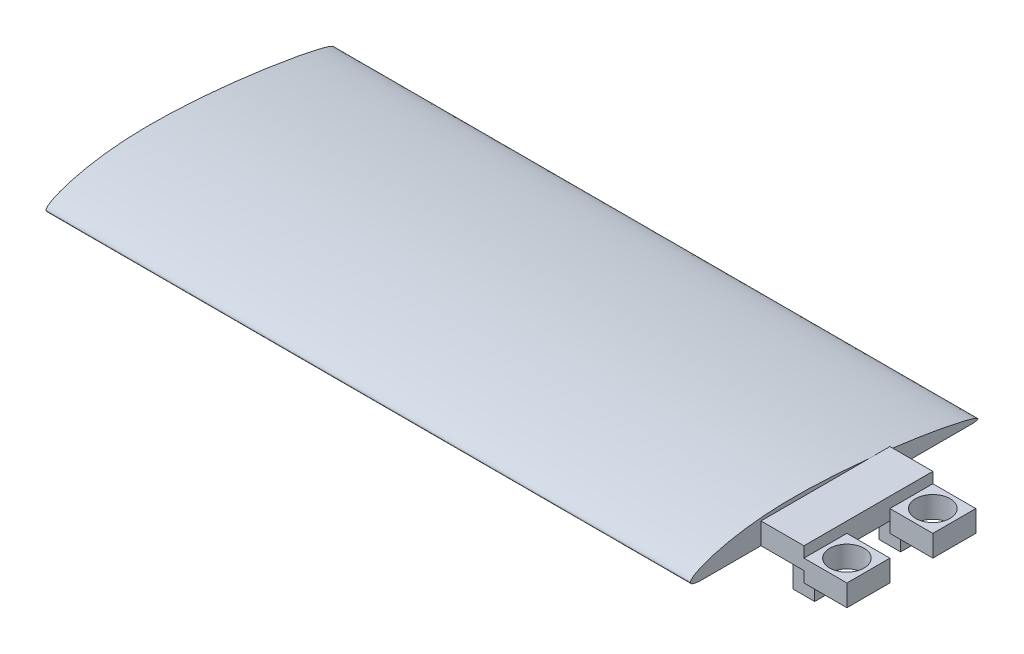
ISO-10303-21;
HEADER;
FILE_DESCRIPTION(('STEP AP214'),'2;1');
FILE_NAME('part.step','',(''),(''),'','','');
FILE_SCHEMA(('AUTOMOTIVE_DESIGN { 1 0 10303 214 1 1 1 1 }'));
ENDSEC;
DATA;
#1=APPLICATION_CONTEXT('core data for automotive mechanical design processes');
#2=APPLICATION_PROTOCOL_DEFINITION('international standard','automotive_design',2000,#1);
#3=PRODUCT_CONTEXT('',#1,'mechanical');
#4=PRODUCT('Part','Part','',(#3));
#5=PRODUCT_RELATED_PRODUCT_CATEGORY('part','',(#4));
#6=PRODUCT_DEFINITION_FORMATION('','',#4);
#7=PRODUCT_DEFINITION_CONTEXT('part definition',#1,'design');
#8=PRODUCT_DEFINITION('design','',#6,#7);
#9=PRODUCT_DEFINITION_SHAPE('','',#8);
#10=(LENGTH_UNIT() NAMED_UNIT(*) SI_UNIT(.MILLI.,.METRE.));
#11=(NAMED_UNIT(*) PLANE_ANGLE_UNIT() SI_UNIT($,.RADIAN.));
#12=(NAMED_UNIT(*) SI_UNIT($,.STERADIAN.) SOLID_ANGLE_UNIT());
#13=UNCERTAINTY_MEASURE_WITH_UNIT(LENGTH_MEASURE(1.E-05),#10,'distance_accuracy_value','');
#14=(GEOMETRIC_REPRESENTATION_CONTEXT(3) GLOBAL_UNCERTAINTY_ASSIGNED_CONTEXT((#13)) GLOBAL_UNIT_ASSIGNED_CONTEXT((#10,
#11,#12)) REPRESENTATION_CONTEXT('',''));
#15=CARTESIAN_POINT('',(0.,0.,0.));
#16=DIRECTION('',(0.,0.,1.));
#17=DIRECTION('',(1.,0.,0.));
#18=AXIS2_PLACEMENT_3D('',#15,#16,#17);
#19=CARTESIAN_POINT('',(-20.,7.5,-25.));
#20=DIRECTION('',(1.,0.,0.));
#21=DIRECTION('',(0.,0.,1.));
#22=AXIS2_PLACEMENT_3D('',#19,#20,#21);
#23=PLANE('',#22);
#24=CARTESIAN_POINT('',(-20.,2.5,-43.5818633417016));
#25=CARTESIAN_POINT('',(-20.,2.5,-54.109415672038));
#26=CARTESIAN_POINT('',(-20.,14.5377672604346,5.82154619961291));
#27=CARTESIAN_POINT('',(-20.,2.5,26.2287373231827));
#28=CARTESIAN_POINT('',(-20.,2.5,18.5389838197817));
#29=B_SPLINE_CURVE_WITH_KNOTS('',3,(#24,#25,#26,#27,#28),.UNSPECIFIED.,.F.,.F.,(4,1,4),(0.,
0.583473653659747,1.),.UNSPECIFIED.);
#30=CARTESIAN_POINT('',(-20.,6.94114038584259,-25.));
#31=VERTEX_POINT('',#30);
#32=CARTESIAN_POINT('',(-20.,7.50000001951237,-20.0732175677515));
#33=VERTEX_POINT('',#32);
#34=EDGE_CURVE('E12',#31,#33,#29,.T.);
#35=ORIENTED_EDGE('',*,*,#34,.T.);
#36=DIRECTION('',(0.,0.,-1.));
#37=VECTOR('',#36,1.);
#38=CARTESIAN_POINT('',(-20.,7.5,-25.));
#39=LINE('',#38,#37);
#40=CARTESIAN_POINT('',(-20.,7.5,-25.));
#41=VERTEX_POINT('',#40);
#42=EDGE_CURVE('E198',#33,#41,#39,.T.);
#43=ORIENTED_EDGE('',*,*,#42,.T.);
#44=DIRECTION('',(0.,-1.,0.));
#45=VECTOR('',#44,1.);
#46=CARTESIAN_POINT('',(-20.,7.5,-25.));
#47=LINE('',#46,#45);
#48=EDGE_CURVE('E211',#41,#31,#47,.T.);
#49=ORIENTED_EDGE('',*,*,#48,.T.);
#50=EDGE_LOOP('',(#35,#43,#49));
#51=FACE_BOUND('',#50,.T.);
#52=ADVANCED_FACE('F48',(#51),#23,.F.);
#53=CARTESIAN_POINT('',(-10.,5.,-5.));
#54=DIRECTION('',(1.,0.,0.));
#55=DIRECTION('',(0.,0.,1.));
#56=AXIS2_PLACEMENT_3D('',#53,#54,#55);
#57=PLANE('',#56);
#58=DIRECTION('',(0.,0.,1.));
#59=VECTOR('',#58,1.);
#60=CARTESIAN_POINT('',(-10.,2.5,-25.));
#61=LINE('',#60,#59);
#62=CARTESIAN_POINT('',(-10.,2.5,-5.));
#63=VERTEX_POINT('',#62);
#64=CARTESIAN_POINT('',(-10.,2.5,-2.5));
#65=VERTEX_POINT('',#64);
#66=EDGE_CURVE('E187',#63,#65,#61,.T.);
#67=ORIENTED_EDGE('',*,*,#66,.F.);
#68=DIRECTION('',(0.,-1.,0.));
#69=VECTOR('',#68,1.);
#70=CARTESIAN_POINT('',(-10.,5.,-5.));
#71=LINE('',#70,#69);
#72=CARTESIAN_POINT('',(-10.,0.,-5.));
#73=VERTEX_POINT('',#72);
#74=EDGE_CURVE('E285',#63,#73,#71,.T.);
#75=ORIENTED_EDGE('',*,*,#74,.T.);
#76=DIRECTION('',(0.,0.,-1.));
#77=VECTOR('',#76,1.);
#78=CARTESIAN_POINT('',(-10.,0.,-5.));
#79=LINE('',#78,#77);
#80=CARTESIAN_POINT('',(-10.,0.,-2.5));
#81=VERTEX_POINT('',#80);
#82=EDGE_CURVE('E252',#81,#73,#79,.T.);
#83=ORIENTED_EDGE('',*,*,#82,.F.);
#84=DIRECTION('',(0.,1.,0.));
#85=VECTOR('',#84,1.);
#86=CARTESIAN_POINT('',(-10.,-5.,-2.5));
#87=LINE('',#86,#85);
#88=EDGE_CURVE('E238',#81,#65,#87,.T.);
#89=ORIENTED_EDGE('',*,*,#88,.T.);
#90=EDGE_LOOP('',(#67,#75,#83,#89));
#91=FACE_BOUND('',#90,.T.);
#92=ADVANCED_FACE('F50',(#91),#57,.F.);
#93=CARTESIAN_POINT('',(-10.,2.5,2.5));
#94=VERTEX_POINT('',#93);
#95=CARTESIAN_POINT('',(-10.,2.5,5.));
#96=VERTEX_POINT('',#95);
#97=EDGE_CURVE('E184',#94,#96,#61,.T.);
#98=ORIENTED_EDGE('',*,*,#97,.F.);
#99=DIRECTION('',(0.,-1.,0.));
#100=VECTOR('',#99,1.);
#101=CARTESIAN_POINT('',(-10.,-5.,2.5));
#102=LINE('',#101,#100);
#103=CARTESIAN_POINT('',(-10.,0.,2.5));
#104=VERTEX_POINT('',#103);
#105=EDGE_CURVE('E239',#94,#104,#102,.T.);
#106=ORIENTED_EDGE('',*,*,#105,.T.);
#107=CARTESIAN_POINT('',(-10.,0.,5.));
#108=VERTEX_POINT('',#107);
#109=EDGE_CURVE('E269',#108,#104,#79,.T.);
#110=ORIENTED_EDGE('',*,*,#109,.F.);
#111=DIRECTION('',(0.,-1.,0.));
#112=VECTOR('',#111,1.);
#113=CARTESIAN_POINT('',(-10.,5.,5.));
#114=LINE('',#113,#112);
#115=EDGE_CURVE('E268',#96,#108,#114,.T.);
#116=ORIENTED_EDGE('',*,*,#115,.F.);
#117=EDGE_LOOP('',(#98,#106,#110,#116));
#118=FACE_BOUND('',#117,.T.);
#119=ADVANCED_FACE('F324',(#118),#57,.F.);
#120=CARTESIAN_POINT('',(0.,5.,0.));
#121=DIRECTION('',(0.,1.,0.));
#122=DIRECTION('',(0.,0.,1.));
#123=AXIS2_PLACEMENT_3D('',#120,#121,#122);
#124=PLANE('',#123);
#125=CARTESIAN_POINT('',(-5.,5.,0.));
#126=DIRECTION('',(0.,-1.,0.));
#127=DIRECTION('',(0.,0.,1.));
#128=AXIS2_PLACEMENT_3D('',#125,#126,#127);
#129=CIRCLE('',#128,4.);
#130=CARTESIAN_POINT('',(-5.,5.,4.));
#131=VERTEX_POINT('',#130);
#132=EDGE_CURVE('E249',#131,#131,#129,.T.);
#133=ORIENTED_EDGE('',*,*,#132,.T.);
#134=EDGE_LOOP('',(#133));
#135=FACE_BOUND('',#134,.T.);
#136=DIRECTION('',(0.,0.,-1.));
#137=VECTOR('',#136,1.);
#138=CARTESIAN_POINT('',(-10.,5.,-5.));
#139=LINE('',#138,#137);
#140=CARTESIAN_POINT('',(-10.,5.,5.));
#141=VERTEX_POINT('',#140);
#142=CARTESIAN_POINT('',(-10.,5.,-5.));
#143=VERTEX_POINT('',#142);
#144=EDGE_CURVE('E255',#141,#143,#139,.T.);
#145=ORIENTED_EDGE('',*,*,#144,.F.);
#146=DIRECTION('',(-1.,0.,0.));
#147=VECTOR('',#146,1.);
#148=CARTESIAN_POINT('',(0.,5.,5.));
#149=LINE('',#148,#147);
#150=CARTESIAN_POINT('',(0.,5.,5.));
#151=VERTEX_POINT('',#150);
#152=EDGE_CURVE('E265',#151,#141,#149,.T.);
#153=ORIENTED_EDGE('',*,*,#152,.F.);
#154=DIRECTION('',(0.,0.,1.));
#155=VECTOR('',#154,1.);
#156=CARTESIAN_POINT('',(0.,5.,-5.));
#157=LINE('',#156,#155);
#158=CARTESIAN_POINT('',(0.,5.,-5.));
#159=VERTEX_POINT('',#158);
#160=EDGE_CURVE('E262',#159,#151,#157,.T.);
#161=ORIENTED_EDGE('',*,*,#160,.F.);
#162=DIRECTION('',(1.,0.,0.));
#163=VECTOR('',#162,1.);
#164=CARTESIAN_POINT('',(0.,5.,-5.));
#165=LINE('',#164,#163);
#166=EDGE_CURVE('E258',#143,#159,#165,.T.);
#167=ORIENTED_EDGE('',*,*,#166,.F.);
#168=EDGE_LOOP('',(#145,#153,#161,#167));
#169=FACE_BOUND('',#168,.T.);
#170=ADVANCED_FACE('F381',(#135,#169),#124,.T.);
#171=CARTESIAN_POINT('',(-15.,-5.,-2.5));
#172=DIRECTION('',(0.,0.,1.));
#173=DIRECTION('',(-1.,0.,0.));
#174=AXIS2_PLACEMENT_3D('',#171,#172,#173);
#175=PLANE('',#174);
#176=DIRECTION('',(1.,0.,0.));
#177=VECTOR('',#176,1.);
#178=CARTESIAN_POINT('',(-15.,2.5,-2.5));
#179=LINE('',#178,#177);
#180=CARTESIAN_POINT('',(-15.,2.5,-2.5));
#181=VERTEX_POINT('',#180);
#182=EDGE_CURVE('E222',#181,#65,#179,.T.);
#183=ORIENTED_EDGE('',*,*,#182,.T.);
#184=ORIENTED_EDGE('',*,*,#88,.F.);
#185=CARTESIAN_POINT('',(-10.,-5.,-2.5));
#186=VERTEX_POINT('',#185);
#187=EDGE_CURVE('E224',#186,#81,#87,.T.);
#188=ORIENTED_EDGE('',*,*,#187,.F.);
#189=DIRECTION('',(1.,0.,0.));
#190=VECTOR('',#189,1.);
#191=CARTESIAN_POINT('',(-15.,-5.,-2.5));
#192=LINE('',#191,#190);
#193=CARTESIAN_POINT('',(-15.,-5.,-2.5));
#194=VERTEX_POINT('',#193);
#195=EDGE_CURVE('E234',#194,#186,#192,.T.);
#196=ORIENTED_EDGE('',*,*,#195,.F.);
#197=DIRECTION('',(0.,1.,0.));
#198=VECTOR('',#197,1.);
#199=CARTESIAN_POINT('',(-15.,-5.,-2.5));
#200=LINE('',#199,#198);
#201=EDGE_CURVE('E225',#194,#181,#200,.T.);
#202=ORIENTED_EDGE('',*,*,#201,.T.);
#203=EDGE_LOOP('',(#183,#184,#188,#196,#202));
#204=FACE_BOUND('',#203,.T.);
#205=ADVANCED_FACE('F311',(#204),#175,.F.);
#206=CARTESIAN_POINT('',(-15.,-5.,2.49999999999999));
#207=DIRECTION('',(0.,0.,-1.));
#208=DIRECTION('',(1.,0.,0.));
#209=AXIS2_PLACEMENT_3D('',#206,#207,#208);
#210=PLANE('',#209);
#211=DIRECTION('',(-1.,0.,0.));
#212=VECTOR('',#211,1.);
#213=CARTESIAN_POINT('',(-15.,2.5,2.49999999999999));
#214=LINE('',#213,#212);
#215=CARTESIAN_POINT('',(-15.,2.5,2.49999999999999));
#216=VERTEX_POINT('',#215);
#217=EDGE_CURVE('E219',#94,#216,#214,.T.);
#218=ORIENTED_EDGE('',*,*,#217,.T.);
#219=DIRECTION('',(0.,-1.,0.));
#220=VECTOR('',#219,1.);
#221=CARTESIAN_POINT('',(-15.,-5.,2.49999999999999));
#222=LINE('',#221,#220);
#223=CARTESIAN_POINT('',(-15.,-5.,2.49999999999999));
#224=VERTEX_POINT('',#223);
#225=EDGE_CURVE('E228',#216,#224,#222,.T.);
#226=ORIENTED_EDGE('',*,*,#225,.T.);
#227=DIRECTION('',(1.,0.,0.));
#228=VECTOR('',#227,1.);
#229=CARTESIAN_POINT('',(-15.,-5.,2.49999999999999));
#230=LINE('',#229,#228);
#231=CARTESIAN_POINT('',(-10.,-5.,2.5));
#232=VERTEX_POINT('',#231);
#233=EDGE_CURVE('E245',#224,#232,#230,.T.);
#234=ORIENTED_EDGE('',*,*,#233,.T.);
#235=EDGE_CURVE('E237',#104,#232,#102,.T.);
#236=ORIENTED_EDGE('',*,*,#235,.F.);
#237=ORIENTED_EDGE('',*,*,#105,.F.);
#238=EDGE_LOOP('',(#218,#226,#234,#236,#237));
#239=FACE_BOUND('',#238,.T.);
#240=ADVANCED_FACE('F320',(#239),#210,.F.);
#241=CARTESIAN_POINT('',(-15.,0.,0.));
#242=DIRECTION('',(1.,0.,0.));
#243=DIRECTION('',(0.,0.,1.));
#244=AXIS2_PLACEMENT_3D('',#241,#242,#243);
#245=PLANE('',#244);
#246=DIRECTION('',(0.,0.,-1.));
#247=VECTOR('',#246,1.);
#248=CARTESIAN_POINT('',(-15.,2.5,0.));
#249=LINE('',#248,#247);
#250=EDGE_CURVE('E52',#216,#181,#249,.T.);
#251=ORIENTED_EDGE('',*,*,#250,.T.);
#252=ORIENTED_EDGE('',*,*,#201,.F.);
#253=DIRECTION('',(0.,0.,-1.));
#254=VECTOR('',#253,1.);
#255=CARTESIAN_POINT('',(-15.,-5.,2.49999999999999));
#256=LINE('',#255,#254);
#257=EDGE_CURVE('E232',#224,#194,#256,.T.);
#258=ORIENTED_EDGE('',*,*,#257,.F.);
#259=ORIENTED_EDGE('',*,*,#225,.F.);
#260=EDGE_LOOP('',(#251,#252,#258,#259));
#261=FACE_BOUND('',#260,.T.);
#262=ADVANCED_FACE('F317',(#261),#245,.F.);
#263=CARTESIAN_POINT('',(0.,0.,0.));
#264=DIRECTION('',(0.,1.,0.));
#265=DIRECTION('',(0.,0.,1.));
#266=AXIS2_PLACEMENT_3D('',#263,#264,#265);
#267=PLANE('',#266);
#268=ORIENTED_EDGE('',*,*,#109,.T.);
#269=EDGE_CURVE('E273',#104,#81,#79,.T.);
#270=ORIENTED_EDGE('',*,*,#269,.T.);
#271=ORIENTED_EDGE('',*,*,#82,.T.);
#272=DIRECTION('',(1.,0.,0.));
#273=VECTOR('',#272,1.);
#274=CARTESIAN_POINT('',(0.,0.,-5.));
#275=LINE('',#274,#273);
#276=CARTESIAN_POINT('',(0.,0.,-5.));
#277=VERTEX_POINT('',#276);
#278=EDGE_CURVE('E272',#73,#277,#275,.T.);
#279=ORIENTED_EDGE('',*,*,#278,.T.);
#280=DIRECTION('',(0.,0.,1.));
#281=VECTOR('',#280,1.);
#282=CARTESIAN_POINT('',(0.,0.,-5.));
#283=LINE('',#282,#281);
#284=CARTESIAN_POINT('',(0.,0.,5.));
#285=VERTEX_POINT('',#284);
#286=EDGE_CURVE('E276',#277,#285,#283,.T.);
#287=ORIENTED_EDGE('',*,*,#286,.T.);
#288=DIRECTION('',(-1.,0.,0.));
#289=VECTOR('',#288,1.);
#290=CARTESIAN_POINT('',(0.,0.,5.));
#291=LINE('',#290,#289);
#292=EDGE_CURVE('E259',#285,#108,#291,.T.);
#293=ORIENTED_EDGE('',*,*,#292,.T.);
#294=EDGE_LOOP('',(#268,#270,#271,#279,#287,#293));
#295=FACE_BOUND('',#294,.T.);
#296=CARTESIAN_POINT('',(-5.,0.,0.));
#297=DIRECTION('',(0.,-1.,0.));
#298=DIRECTION('',(0.,0.,1.));
#299=AXIS2_PLACEMENT_3D('',#296,#297,#298);
#300=CIRCLE('',#299,4.);
#301=CARTESIAN_POINT('',(-5.,0.,4.));
#302=VERTEX_POINT('',#301);
#303=EDGE_CURVE('E248',#302,#302,#300,.T.);
#304=ORIENTED_EDGE('',*,*,#303,.F.);
#305=EDGE_LOOP('',(#304));
#306=FACE_BOUND('',#305,.T.);
#307=ADVANCED_FACE('F300',(#295,#306),#267,.F.);
#308=CARTESIAN_POINT('',(0.,5.,-5.));
#309=DIRECTION('',(0.,0.,1.));
#310=DIRECTION('',(-1.,0.,0.));
#311=AXIS2_PLACEMENT_3D('',#308,#309,#310);
#312=PLANE('',#311);
#313=ORIENTED_EDGE('',*,*,#278,.F.);
#314=ORIENTED_EDGE('',*,*,#74,.F.);
#315=EDGE_CURVE('E286',#143,#63,#71,.T.);
#316=ORIENTED_EDGE('',*,*,#315,.F.);
#317=ORIENTED_EDGE('',*,*,#166,.T.);
#318=DIRECTION('',(0.,-1.,0.));
#319=VECTOR('',#318,1.);
#320=CARTESIAN_POINT('',(0.,5.,-5.));
#321=LINE('',#320,#319);
#322=EDGE_CURVE('E284',#159,#277,#321,.T.);
#323=ORIENTED_EDGE('',*,*,#322,.T.);
#324=EDGE_LOOP('',(#313,#314,#316,#317,#323));
#325=FACE_BOUND('',#324,.T.);
#326=ADVANCED_FACE('F296',(#325),#312,.F.);
#327=CARTESIAN_POINT('',(0.,5.,-5.));
#328=DIRECTION('',(-1.,0.,0.));
#329=DIRECTION('',(0.,0.,-1.));
#330=AXIS2_PLACEMENT_3D('',#327,#328,#329);
#331=PLANE('',#330);
#332=ORIENTED_EDGE('',*,*,#286,.F.);
#333=ORIENTED_EDGE('',*,*,#322,.F.);
#334=ORIENTED_EDGE('',*,*,#160,.T.);
#335=DIRECTION('',(0.,-1.,0.));
#336=VECTOR('',#335,1.);
#337=CARTESIAN_POINT('',(0.,5.,5.));
#338=LINE('',#337,#336);
#339=EDGE_CURVE('E282',#151,#285,#338,.T.);
#340=ORIENTED_EDGE('',*,*,#339,.T.);
#341=EDGE_LOOP('',(#332,#333,#334,#340));
#342=FACE_BOUND('',#341,.T.);
#343=ADVANCED_FACE('F392',(#342),#331,.F.);
#344=CARTESIAN_POINT('',(0.,5.,5.));
#345=DIRECTION('',(0.,0.,-1.));
#346=DIRECTION('',(1.,0.,0.));
#347=AXIS2_PLACEMENT_3D('',#344,#345,#346);
#348=PLANE('',#347);
#349=ORIENTED_EDGE('',*,*,#292,.F.);
#350=ORIENTED_EDGE('',*,*,#339,.F.);
#351=ORIENTED_EDGE('',*,*,#152,.T.);
#352=DIRECTION('',(0.,-1.,0.));
#353=VECTOR('',#352,1.);
#354=CARTESIAN_POINT('',(-10.,7.5,5.));
#355=LINE('',#354,#353);
#356=CARTESIAN_POINT('',(-10.,7.5,5.));
#357=VERTEX_POINT('',#356);
#358=EDGE_CURVE('E217',#357,#141,#355,.T.);
#359=ORIENTED_EDGE('',*,*,#358,.F.);
#360=DIRECTION('',(-1.,0.,0.));
#361=VECTOR('',#360,1.);
#362=CARTESIAN_POINT('',(-10.,7.5,5.));
#363=LINE('',#362,#361);
#364=CARTESIAN_POINT('',(-20.,7.5,5.));
#365=VERTEX_POINT('',#364);
#366=EDGE_CURVE('E194',#357,#365,#363,.T.);
#367=ORIENTED_EDGE('',*,*,#366,.T.);
#368=DIRECTION('',(0.,-1.,0.));
#369=VECTOR('',#368,1.);
#370=CARTESIAN_POINT('',(-20.,7.5,5.));
#371=LINE('',#370,#369);
#372=CARTESIAN_POINT('',(-20.,2.5,5.));
#373=VERTEX_POINT('',#372);
#374=EDGE_CURVE('E214',#365,#373,#371,.T.);
#375=ORIENTED_EDGE('',*,*,#374,.T.);
#376=DIRECTION('',(-1.,0.,0.));
#377=VECTOR('',#376,1.);
#378=CARTESIAN_POINT('',(-10.,2.5,5.));
#379=LINE('',#378,#377);
#380=EDGE_CURVE('E205',#96,#373,#379,.T.);
#381=ORIENTED_EDGE('',*,*,#380,.F.);
#382=ORIENTED_EDGE('',*,*,#115,.T.);
#383=EDGE_LOOP('',(#349,#350,#351,#359,#367,#375,#381,#382));
#384=FACE_BOUND('',#383,.T.);
#385=ADVANCED_FACE('F328',(#384),#348,.F.);
#386=CARTESIAN_POINT('',(-5.,5.,0.));
#387=DIRECTION('',(0.,-1.,0.));
#388=DIRECTION('',(0.,0.,-1.));
#389=AXIS2_PLACEMENT_3D('',#386,#387,#388);
#390=CYLINDRICAL_SURFACE('',#389,4.);
#391=ORIENTED_EDGE('',*,*,#132,.F.);
#392=EDGE_LOOP('',(#391));
#393=FACE_BOUND('',#392,.T.);
#394=ORIENTED_EDGE('',*,*,#303,.T.);
#395=EDGE_LOOP('',(#394));
#396=FACE_BOUND('',#395,.T.);
#397=ADVANCED_FACE('F375',(#393,#396),#390,.F.);
#398=CARTESIAN_POINT('',(-15.,-5.,2.49999999999999));
#399=DIRECTION('',(0.,1.,0.));
#400=DIRECTION('',(0.,0.,1.));
#401=AXIS2_PLACEMENT_3D('',#398,#399,#400);
#402=PLANE('',#401);
#403=DIRECTION('',(0.,0.,-1.));
#404=VECTOR('',#403,1.);
#405=CARTESIAN_POINT('',(-10.,-5.,2.5));
#406=LINE('',#405,#404);
#407=EDGE_CURVE('E229',#232,#186,#406,.T.);
#408=ORIENTED_EDGE('',*,*,#407,.F.);
#409=ORIENTED_EDGE('',*,*,#233,.F.);
#410=ORIENTED_EDGE('',*,*,#257,.T.);
#411=ORIENTED_EDGE('',*,*,#195,.T.);
#412=EDGE_LOOP('',(#408,#409,#410,#411));
#413=FACE_BOUND('',#412,.T.);
#414=ADVANCED_FACE('F372',(#413),#402,.F.);
#415=CARTESIAN_POINT('',(-10.,0.,0.));
#416=DIRECTION('',(1.,0.,0.));
#417=DIRECTION('',(0.,0.,1.));
#418=AXIS2_PLACEMENT_3D('',#415,#416,#417);
#419=PLANE('',#418);
#420=ORIENTED_EDGE('',*,*,#235,.T.);
#421=ORIENTED_EDGE('',*,*,#407,.T.);
#422=ORIENTED_EDGE('',*,*,#187,.T.);
#423=ORIENTED_EDGE('',*,*,#269,.F.);
#424=EDGE_LOOP('',(#420,#421,#422,#423));
#425=FACE_BOUND('',#424,.T.);
#426=ADVANCED_FACE('F308',(#425),#419,.T.);
#427=CARTESIAN_POINT('',(-10.,7.5,-25.));
#428=DIRECTION('',(-1.,0.,0.));
#429=DIRECTION('',(0.,0.,-1.));
#430=AXIS2_PLACEMENT_3D('',#427,#428,#429);
#431=PLANE('',#430);
#432=ORIENTED_EDGE('',*,*,#144,.T.);
#433=ORIENTED_EDGE('',*,*,#315,.T.);
#434=CARTESIAN_POINT('',(-10.,2.5,-25.));
#435=VERTEX_POINT('',#434);
#436=EDGE_CURVE('E73',#435,#63,#61,.T.);
#437=ORIENTED_EDGE('',*,*,#436,.F.);
#438=DIRECTION('',(0.,-1.,0.));
#439=VECTOR('',#438,1.);
#440=CARTESIAN_POINT('',(-10.,7.5,-25.));
#441=LINE('',#440,#439);
#442=CARTESIAN_POINT('',(-10.,7.5,-25.));
#443=VERTEX_POINT('',#442);
#444=EDGE_CURVE('E203',#443,#435,#441,.T.);
#445=ORIENTED_EDGE('',*,*,#444,.F.);
#446=DIRECTION('',(0.,0.,1.));
#447=VECTOR('',#446,1.);
#448=CARTESIAN_POINT('',(-10.,7.5,-25.));
#449=LINE('',#448,#447);
#450=EDGE_CURVE('E192',#443,#357,#449,.T.);
#451=ORIENTED_EDGE('',*,*,#450,.T.);
#452=ORIENTED_EDGE('',*,*,#358,.T.);
#453=EDGE_LOOP('',(#432,#433,#437,#445,#451,#452));
#454=FACE_BOUND('',#453,.T.);
#455=ADVANCED_FACE('F359',(#454),#431,.F.);
#456=CARTESIAN_POINT('',(0.,2.5,0.));
#457=DIRECTION('',(0.,1.,0.));
#458=DIRECTION('',(0.,0.,1.));
#459=AXIS2_PLACEMENT_3D('',#456,#457,#458);
#460=PLANE('',#459);
#461=ORIENTED_EDGE('',*,*,#250,.F.);
#462=ORIENTED_EDGE('',*,*,#217,.F.);
#463=ORIENTED_EDGE('',*,*,#97,.T.);
#464=ORIENTED_EDGE('',*,*,#380,.T.);
#465=DIRECTION('',(0.,0.,-1.));
#466=VECTOR('',#465,1.);
#467=CARTESIAN_POINT('',(-20.,2.5,18.5389838197817));
#468=LINE('',#467,#466);
#469=CARTESIAN_POINT('',(-20.,2.5,18.5389838197817));
#470=VERTEX_POINT('',#469);
#471=EDGE_CURVE('E178',#470,#373,#468,.T.);
#472=ORIENTED_EDGE('',*,*,#471,.F.);
#473=DIRECTION('',(1.,0.,0.));
#474=VECTOR('',#473,1.);
#475=CARTESIAN_POINT('',(-170.,2.5,18.5389838197817));
#476=LINE('',#475,#474);
#477=CARTESIAN_POINT('',(-170.,2.5,18.5389838197817));
#478=VERTEX_POINT('',#477);
#479=EDGE_CURVE('E171',#478,#470,#476,.T.);
#480=ORIENTED_EDGE('',*,*,#479,.F.);
#481=DIRECTION('',(0.,0.,-1.));
#482=VECTOR('',#481,1.);
#483=CARTESIAN_POINT('',(-170.,2.5,18.5389838197817));
#484=LINE('',#483,#482);
#485=CARTESIAN_POINT('',(-170.,2.5,-43.5818633417016));
#486=VERTEX_POINT('',#485);
#487=EDGE_CURVE('E177',#478,#486,#484,.T.);
#488=ORIENTED_EDGE('',*,*,#487,.T.);
#489=DIRECTION('',(1.,0.,0.));
#490=VECTOR('',#489,1.);
#491=CARTESIAN_POINT('',(-170.,2.5,-43.5818633417016));
#492=LINE('',#491,#490);
#493=CARTESIAN_POINT('',(-20.,2.5,-43.5818633417016));
#494=VERTEX_POINT('',#493);
#495=EDGE_CURVE('E174',#486,#494,#492,.T.);
#496=ORIENTED_EDGE('',*,*,#495,.T.);
#497=CARTESIAN_POINT('',(-20.,2.5,-25.));
#498=VERTEX_POINT('',#497);
#499=EDGE_CURVE('E334',#498,#494,#468,.T.);
#500=ORIENTED_EDGE('',*,*,#499,.F.);
#501=DIRECTION('',(1.,0.,0.));
#502=VECTOR('',#501,1.);
#503=CARTESIAN_POINT('',(-10.,2.5,-25.));
#504=LINE('',#503,#502);
#505=EDGE_CURVE('E195',#498,#435,#504,.T.);
#506=ORIENTED_EDGE('',*,*,#505,.T.);
#507=ORIENTED_EDGE('',*,*,#436,.T.);
#508=ORIENTED_EDGE('',*,*,#66,.T.);
#509=ORIENTED_EDGE('',*,*,#182,.F.);
#510=EDGE_LOOP('',(#461,#462,#463,#464,#472,#480,#488,#496,#500,#506,#507,#508,#509));
#511=FACE_BOUND('',#510,.T.);
#512=ADVANCED_FACE('F182',(#511),#460,.F.);
#513=CARTESIAN_POINT('',(-10.,7.5,-25.));
#514=DIRECTION('',(0.,0.,1.));
#515=DIRECTION('',(-1.,0.,0.));
#516=AXIS2_PLACEMENT_3D('',#513,#514,#515);
#517=PLANE('',#516);
#518=ORIENTED_EDGE('',*,*,#505,.F.);
#519=EDGE_CURVE('E210',#31,#498,#47,.T.);
#520=ORIENTED_EDGE('',*,*,#519,.F.);
#521=ORIENTED_EDGE('',*,*,#48,.F.);
#522=DIRECTION('',(1.,0.,0.));
#523=VECTOR('',#522,1.);
#524=CARTESIAN_POINT('',(-10.,7.5,-25.));
#525=LINE('',#524,#523);
#526=EDGE_CURVE('E202',#41,#443,#525,.T.);
#527=ORIENTED_EDGE('',*,*,#526,.T.);
#528=ORIENTED_EDGE('',*,*,#444,.T.);
#529=EDGE_LOOP('',(#518,#520,#521,#527,#528));
#530=FACE_BOUND('',#529,.T.);
#531=ADVANCED_FACE('F355',(#530),#517,.F.);
#532=CARTESIAN_POINT('',(0.,7.5,0.));
#533=DIRECTION('',(0.,1.,0.));
#534=DIRECTION('',(0.,0.,1.));
#535=AXIS2_PLACEMENT_3D('',#532,#533,#534);
#536=PLANE('',#535);
#537=ORIENTED_EDGE('',*,*,#450,.F.);
#538=ORIENTED_EDGE('',*,*,#526,.F.);
#539=ORIENTED_EDGE('',*,*,#42,.F.);
#540=EDGE_CURVE('E199',#365,#33,#39,.T.);
#541=ORIENTED_EDGE('',*,*,#540,.F.);
#542=ORIENTED_EDGE('',*,*,#366,.F.);
#543=EDGE_LOOP('',(#537,#538,#539,#541,#542));
#544=FACE_BOUND('',#543,.T.);
#545=ADVANCED_FACE('F352',(#544),#536,.T.);
#546=CARTESIAN_POINT('',(-20.,8.39569452755327,-7.51523728594603));
#547=DIRECTION('',(-1.,0.,0.));
#548=DIRECTION('',(0.,1.,0.));
#549=AXIS2_PLACEMENT_3D('',#546,#547,#548);
#550=PLANE('',#549);
#551=ORIENTED_EDGE('',*,*,#519,.T.);
#552=ORIENTED_EDGE('',*,*,#499,.T.);
#553=EDGE_CURVE('E58',#494,#31,#29,.T.);
#554=ORIENTED_EDGE('',*,*,#553,.T.);
#555=EDGE_LOOP('',(#551,#552,#554));
#556=FACE_BOUND('',#555,.T.);
#557=ADVANCED_FACE('F350',(#556),#550,.F.);
#558=CARTESIAN_POINT('',(-170.,2.5,-43.5818633417016));
#559=CARTESIAN_POINT('',(-170.,2.5,-54.109415672038));
#560=CARTESIAN_POINT('',(-170.,14.5377672604346,5.8215461996129));
#561=CARTESIAN_POINT('',(-170.,2.5,26.2287373231827));
#562=CARTESIAN_POINT('',(-170.,2.5,18.5389838197817));
#563=B_SPLINE_CURVE_WITH_KNOTS('',3,(#558,#559,#560,#561,#562),.UNSPECIFIED.,.F.,.F.,(4,1,4),
(0.,0.583473653659747,1.),.UNSPECIFIED.);
#564=DIRECTION('',(1.,0.,0.));
#565=VECTOR('',#564,1.);
#566=SURFACE_OF_LINEAR_EXTRUSION('',#563,#565);
#567=ORIENTED_EDGE('',*,*,#553,.F.);
#568=ORIENTED_EDGE('',*,*,#495,.F.);
#569=EDGE_CURVE('E167',#486,#478,#563,.T.);
#570=ORIENTED_EDGE('',*,*,#569,.T.);
#571=ORIENTED_EDGE('',*,*,#479,.T.);
#572=EDGE_CURVE('E59',#33,#470,#29,.T.);
#573=ORIENTED_EDGE('',*,*,#572,.F.);
#574=ORIENTED_EDGE('',*,*,#34,.F.);
#575=EDGE_LOOP('',(#567,#568,#570,#571,#573,#574));
#576=FACE_BOUND('',#575,.T.);
#577=ADVANCED_FACE('F169',(#576),#566,.T.);
#578=CARTESIAN_POINT('',(-170.,8.39569452755327,-7.51523728594604));
#579=DIRECTION('',(-1.,0.,0.));
#580=DIRECTION('',(0.,1.,0.));
#581=AXIS2_PLACEMENT_3D('',#578,#579,#580);
#582=PLANE('',#581);
#583=ORIENTED_EDGE('',*,*,#569,.F.);
#584=ORIENTED_EDGE('',*,*,#487,.F.);
#585=EDGE_LOOP('',(#583,#584));
#586=FACE_BOUND('',#585,.T.);
#587=ADVANCED_FACE('F180',(#586),#582,.T.);
#588=ORIENTED_EDGE('',*,*,#540,.T.);
#589=ORIENTED_EDGE('',*,*,#572,.T.);
#590=ORIENTED_EDGE('',*,*,#471,.T.);
#591=ORIENTED_EDGE('',*,*,#374,.F.);
#592=EDGE_LOOP('',(#588,#589,#590,#591));
#593=FACE_BOUND('',#592,.T.);
#594=ADVANCED_FACE('F332',(#593),#550,.F.);
#595=CLOSED_SHELL('',(#52,#92,#119,#170,#205,#240,#262,#307,#326,#343,#385,#397,#414,#426,#455,
#512,#531,#545,#557,#577,#587,#594));
#596=MANIFOLD_SOLID_BREP('B2',#595);
#597=CARTESIAN_POINT('',(-15.,-5.,-22.5));
#598=DIRECTION('',(0.,0.,1.));
#599=DIRECTION('',(-1.,0.,0.));
#600=AXIS2_PLACEMENT_3D('',#597,#598,#599);
#601=PLANE('',#600);
#602=DIRECTION('',(0.,1.,0.));
#603=VECTOR('',#602,1.);
#604=CARTESIAN_POINT('',(-9.99999999999999,-5.,-22.5));
#605=LINE('',#604,#603);
#606=CARTESIAN_POINT('',(-9.99999999999999,-5.,-22.5));
#607=VERTEX_POINT('',#606);
#608=CARTESIAN_POINT('',(-9.99999999999999,5.,-22.5));
#609=VERTEX_POINT('',#608);
#610=EDGE_CURVE('E631',#607,#609,#605,.T.);
#611=ORIENTED_EDGE('',*,*,#610,.F.);
#612=DIRECTION('',(1.,0.,0.));
#613=VECTOR('',#612,1.);
#614=CARTESIAN_POINT('',(-15.,-5.,-22.5));
#615=LINE('',#614,#613);
#616=CARTESIAN_POINT('',(-15.,-5.,-22.5));
#617=VERTEX_POINT('',#616);
#618=EDGE_CURVE('E630',#617,#607,#615,.T.);
#619=ORIENTED_EDGE('',*,*,#618,.F.);
#620=DIRECTION('',(0.,1.,0.));
#621=VECTOR('',#620,1.);
#622=CARTESIAN_POINT('',(-15.,-5.,-22.5));
#623=LINE('',#622,#621);
#624=CARTESIAN_POINT('',(-15.,5.,-22.5));
#625=VERTEX_POINT('',#624);
#626=EDGE_CURVE('E625',#617,#625,#623,.T.);
#627=ORIENTED_EDGE('',*,*,#626,.T.);
#628=DIRECTION('',(1.,0.,0.));
#629=VECTOR('',#628,1.);
#630=CARTESIAN_POINT('',(-15.,5.,-22.5));
#631=LINE('',#630,#629);
#632=EDGE_CURVE('E46',#625,#609,#631,.T.);
#633=ORIENTED_EDGE('',*,*,#632,.T.);
#634=EDGE_LOOP('',(#611,#619,#627,#633));
#635=FACE_BOUND('',#634,.T.);
#636=ADVANCED_FACE('F568',(#635),#601,.F.);
#637=CARTESIAN_POINT('',(-15.,5.,-17.5));
#638=DIRECTION('',(0.,-1.,0.));
#639=DIRECTION('',(0.,0.,-1.));
#640=AXIS2_PLACEMENT_3D('',#637,#638,#639);
#641=PLANE('',#640);
#642=DIRECTION('',(0.,0.,1.));
#643=VECTOR('',#642,1.);
#644=CARTESIAN_POINT('',(-9.99999999999999,5.,-17.5));
#645=LINE('',#644,#643);
#646=CARTESIAN_POINT('',(-9.99999999999999,5.,-17.5));
#647=VERTEX_POINT('',#646);
#648=EDGE_CURVE('E633',#609,#647,#645,.T.);
#649=ORIENTED_EDGE('',*,*,#648,.F.);
#650=ORIENTED_EDGE('',*,*,#632,.F.);
#651=DIRECTION('',(0.,0.,1.));
#652=VECTOR('',#651,1.);
#653=CARTESIAN_POINT('',(-15.,5.,-17.5));
#654=LINE('',#653,#652);
#655=CARTESIAN_POINT('',(-15.,5.,-17.5));
#656=VERTEX_POINT('',#655);
#657=EDGE_CURVE('E609',#625,#656,#654,.T.);
#658=ORIENTED_EDGE('',*,*,#657,.T.);
#659=DIRECTION('',(1.,0.,0.));
#660=VECTOR('',#659,1.);
#661=CARTESIAN_POINT('',(-15.,5.,-17.5));
#662=LINE('',#661,#660);
#663=EDGE_CURVE('E576',#656,#647,#662,.T.);
#664=ORIENTED_EDGE('',*,*,#663,.T.);
#665=EDGE_LOOP('',(#649,#650,#658,#664));
#666=FACE_BOUND('',#665,.T.);
#667=ADVANCED_FACE('F623',(#666),#641,.F.);
#668=CARTESIAN_POINT('',(-15.,-5.,-17.5));
#669=DIRECTION('',(0.,0.,-1.));
#670=DIRECTION('',(1.,0.,0.));
#671=AXIS2_PLACEMENT_3D('',#668,#669,#670);
#672=PLANE('',#671);
#673=DIRECTION('',(0.,-1.,0.));
#674=VECTOR('',#673,1.);
#675=CARTESIAN_POINT('',(-9.99999999999999,-5.,-17.5));
#676=LINE('',#675,#674);
#677=CARTESIAN_POINT('',(-9.99999999999999,-5.,-17.5));
#678=VERTEX_POINT('',#677);
#679=EDGE_CURVE('E619',#647,#678,#676,.T.);
#680=ORIENTED_EDGE('',*,*,#679,.F.);
#681=ORIENTED_EDGE('',*,*,#663,.F.);
#682=DIRECTION('',(0.,-1.,0.));
#683=VECTOR('',#682,1.);
#684=CARTESIAN_POINT('',(-15.,-5.,-17.5));
#685=LINE('',#684,#683);
#686=CARTESIAN_POINT('',(-15.,-5.,-17.5));
#687=VERTEX_POINT('',#686);
#688=EDGE_CURVE('E612',#656,#687,#685,.T.);
#689=ORIENTED_EDGE('',*,*,#688,.T.);
#690=DIRECTION('',(1.,0.,0.));
#691=VECTOR('',#690,1.);
#692=CARTESIAN_POINT('',(-15.,-5.,-17.5));
#693=LINE('',#692,#691);
#694=EDGE_CURVE('E622',#687,#678,#693,.T.);
#695=ORIENTED_EDGE('',*,*,#694,.T.);
#696=EDGE_LOOP('',(#680,#681,#689,#695));
#697=FACE_BOUND('',#696,.T.);
#698=ADVANCED_FACE('F618',(#697),#672,.F.);
#699=CARTESIAN_POINT('',(-15.,-5.,-17.5));
#700=DIRECTION('',(0.,1.,0.));
#701=DIRECTION('',(0.,0.,1.));
#702=AXIS2_PLACEMENT_3D('',#699,#700,#701);
#703=PLANE('',#702);
#704=DIRECTION('',(0.,0.,-1.));
#705=VECTOR('',#704,1.);
#706=CARTESIAN_POINT('',(-9.99999999999999,-5.,-17.5));
#707=LINE('',#706,#705);
#708=EDGE_CURVE('E598',#678,#607,#707,.T.);
#709=ORIENTED_EDGE('',*,*,#708,.F.);
#710=ORIENTED_EDGE('',*,*,#694,.F.);
#711=DIRECTION('',(0.,0.,-1.));
#712=VECTOR('',#711,1.);
#713=CARTESIAN_POINT('',(-15.,-5.,-17.5));
#714=LINE('',#713,#712);
#715=EDGE_CURVE('E584',#687,#617,#714,.T.);
#716=ORIENTED_EDGE('',*,*,#715,.T.);
#717=ORIENTED_EDGE('',*,*,#618,.T.);
#718=EDGE_LOOP('',(#709,#710,#716,#717));
#719=FACE_BOUND('',#718,.T.);
#720=ADVANCED_FACE('F642',(#719),#703,.F.);
#721=CARTESIAN_POINT('',(-15.,0.,0.));
#722=DIRECTION('',(1.,0.,0.));
#723=DIRECTION('',(0.,0.,1.));
#724=AXIS2_PLACEMENT_3D('',#721,#722,#723);
#725=PLANE('',#724);
#726=ORIENTED_EDGE('',*,*,#626,.F.);
#727=ORIENTED_EDGE('',*,*,#715,.F.);
#728=ORIENTED_EDGE('',*,*,#688,.F.);
#729=ORIENTED_EDGE('',*,*,#657,.F.);
#730=EDGE_LOOP('',(#726,#727,#728,#729));
#731=FACE_BOUND('',#730,.T.);
#732=ADVANCED_FACE('F614',(#731),#725,.F.);
#733=CARTESIAN_POINT('',(-10.,0.,0.));
#734=DIRECTION('',(1.,0.,0.));
#735=DIRECTION('',(0.,0.,1.));
#736=AXIS2_PLACEMENT_3D('',#733,#734,#735);
#737=PLANE('',#736);
#738=ORIENTED_EDGE('',*,*,#610,.T.);
#739=ORIENTED_EDGE('',*,*,#648,.T.);
#740=ORIENTED_EDGE('',*,*,#679,.T.);
#741=ORIENTED_EDGE('',*,*,#708,.T.);
#742=EDGE_LOOP('',(#738,#739,#740,#741));
#743=FACE_BOUND('',#742,.T.);
#744=ADVANCED_FACE('F638',(#743),#737,.T.);
#745=CLOSED_SHELL('',(#636,#667,#698,#720,#732,#744));
#746=MANIFOLD_SOLID_BREP('B6',#745);
#747=CARTESIAN_POINT('',(0.,5.,0.));
#748=DIRECTION('',(0.,-1.,0.));
#749=DIRECTION('',(0.,0.,-1.));
#750=AXIS2_PLACEMENT_3D('',#747,#748,#749);
#751=PLANE('',#750);
#752=DIRECTION('',(0.,0.,1.));
#753=VECTOR('',#752,1.);
#754=CARTESIAN_POINT('',(0.,5.,-15.));
#755=LINE('',#754,#753);
#756=CARTESIAN_POINT('',(0.,5.,-25.));
#757=VERTEX_POINT('',#756);
#758=CARTESIAN_POINT('',(0.,5.,-15.));
#759=VERTEX_POINT('',#758);
#760=EDGE_CURVE('E748',#757,#759,#755,.T.);
#761=ORIENTED_EDGE('',*,*,#760,.F.);
#762=DIRECTION('',(1.,0.,0.));
#763=VECTOR('',#762,1.);
#764=CARTESIAN_POINT('',(0.,5.,-25.));
#765=LINE('',#764,#763);
#766=CARTESIAN_POINT('',(-10.,5.,-25.));
#767=VERTEX_POINT('',#766);
#768=EDGE_CURVE('E751',#767,#757,#765,.T.);
#769=ORIENTED_EDGE('',*,*,#768,.F.);
#770=DIRECTION('',(0.,0.,-1.));
#771=VECTOR('',#770,1.);
#772=CARTESIAN_POINT('',(-9.99999999999999,5.,-15.));
#773=LINE('',#772,#771);
#774=CARTESIAN_POINT('',(-9.99999999999999,5.,-15.));
#775=VERTEX_POINT('',#774);
#776=EDGE_CURVE('E739',#775,#767,#773,.T.);
#777=ORIENTED_EDGE('',*,*,#776,.F.);
#778=DIRECTION('',(-1.,0.,0.));
#779=VECTOR('',#778,1.);
#780=CARTESIAN_POINT('',(0.,5.,-15.));
#781=LINE('',#780,#779);
#782=EDGE_CURVE('E744',#759,#775,#781,.T.);
#783=ORIENTED_EDGE('',*,*,#782,.F.);
#784=EDGE_LOOP('',(#761,#769,#777,#783));
#785=FACE_BOUND('',#784,.T.);
#786=CARTESIAN_POINT('',(-5.,5.,-20.));
#787=DIRECTION('',(0.,-1.,0.));
#788=DIRECTION('',(0.,0.,-1.));
#789=AXIS2_PLACEMENT_3D('',#786,#787,#788);
#790=CIRCLE('',#789,4.);
#791=CARTESIAN_POINT('',(-5.,5.,-24.));
#792=VERTEX_POINT('',#791);
#793=EDGE_CURVE('E760',#792,#792,#790,.T.);
#794=ORIENTED_EDGE('',*,*,#793,.T.);
#795=EDGE_LOOP('',(#794));
#796=FACE_BOUND('',#795,.T.);
#797=ADVANCED_FACE('F692',(#785,#796),#751,.F.);
#798=CARTESIAN_POINT('',(0.,0.,0.));
#799=DIRECTION('',(0.,-1.,0.));
#800=DIRECTION('',(0.,0.,-1.));
#801=AXIS2_PLACEMENT_3D('',#798,#799,#800);
#802=PLANE('',#801);
#803=DIRECTION('',(0.,0.,1.));
#804=VECTOR('',#803,1.);
#805=CARTESIAN_POINT('',(0.,0.,-15.));
#806=LINE('',#805,#804);
#807=CARTESIAN_POINT('',(0.,0.,-25.));
#808=VERTEX_POINT('',#807);
#809=CARTESIAN_POINT('',(0.,0.,-15.));
#810=VERTEX_POINT('',#809);
#811=EDGE_CURVE('E756',#808,#810,#806,.T.);
#812=ORIENTED_EDGE('',*,*,#811,.T.);
#813=DIRECTION('',(-1.,0.,0.));
#814=VECTOR('',#813,1.);
#815=CARTESIAN_POINT('',(0.,0.,-15.));
#816=LINE('',#815,#814);
#817=CARTESIAN_POINT('',(-9.99999999999999,0.,-15.));
#818=VERTEX_POINT('',#817);
#819=EDGE_CURVE('E759',#810,#818,#816,.T.);
#820=ORIENTED_EDGE('',*,*,#819,.T.);
#821=DIRECTION('',(0.,0.,-1.));
#822=VECTOR('',#821,1.);
#823=CARTESIAN_POINT('',(-9.99999999999999,0.,-15.));
#824=LINE('',#823,#822);
#825=CARTESIAN_POINT('',(-10.,0.,-25.));
#826=VERTEX_POINT('',#825);
#827=EDGE_CURVE('E742',#818,#826,#824,.T.);
#828=ORIENTED_EDGE('',*,*,#827,.T.);
#829=DIRECTION('',(1.,0.,0.));
#830=VECTOR('',#829,1.);
#831=CARTESIAN_POINT('',(0.,0.,-25.));
#832=LINE('',#831,#830);
#833=EDGE_CURVE('E763',#826,#808,#832,.T.);
#834=ORIENTED_EDGE('',*,*,#833,.T.);
#835=EDGE_LOOP('',(#812,#820,#828,#834));
#836=FACE_BOUND('',#835,.T.);
#837=CARTESIAN_POINT('',(-5.,0.,-20.));
#838=DIRECTION('',(0.,-1.,0.));
#839=DIRECTION('',(0.,0.,-1.));
#840=AXIS2_PLACEMENT_3D('',#837,#838,#839);
#841=CIRCLE('',#840,4.);
#842=CARTESIAN_POINT('',(-5.,0.,-24.));
#843=VERTEX_POINT('',#842);
#844=EDGE_CURVE('E768',#843,#843,#841,.T.);
#845=ORIENTED_EDGE('',*,*,#844,.F.);
#846=EDGE_LOOP('',(#845));
#847=FACE_BOUND('',#846,.T.);
#848=ADVANCED_FACE('F781',(#836,#847),#802,.T.);
#849=CARTESIAN_POINT('',(0.,5.,-15.));
#850=DIRECTION('',(-1.,0.,0.));
#851=DIRECTION('',(0.,0.,-1.));
#852=AXIS2_PLACEMENT_3D('',#849,#850,#851);
#853=PLANE('',#852);
#854=ORIENTED_EDGE('',*,*,#811,.F.);
#855=DIRECTION('',(0.,-1.,0.));
#856=VECTOR('',#855,1.);
#857=CARTESIAN_POINT('',(0.,5.,-25.));
#858=LINE('',#857,#856);
#859=EDGE_CURVE('E709',#757,#808,#858,.T.);
#860=ORIENTED_EDGE('',*,*,#859,.F.);
#861=ORIENTED_EDGE('',*,*,#760,.T.);
#862=DIRECTION('',(0.,-1.,0.));
#863=VECTOR('',#862,1.);
#864=CARTESIAN_POINT('',(0.,5.,-15.));
#865=LINE('',#864,#863);
#866=EDGE_CURVE('E566',#759,#810,#865,.T.);
#867=ORIENTED_EDGE('',*,*,#866,.T.);
#868=EDGE_LOOP('',(#854,#860,#861,#867));
#869=FACE_BOUND('',#868,.T.);
#870=ADVANCED_FACE('F694',(#869),#853,.F.);
#871=CARTESIAN_POINT('',(0.,5.,-15.));
#872=DIRECTION('',(0.,0.,-1.));
#873=DIRECTION('',(1.,0.,0.));
#874=AXIS2_PLACEMENT_3D('',#871,#872,#873);
#875=PLANE('',#874);
#876=ORIENTED_EDGE('',*,*,#819,.F.);
#877=ORIENTED_EDGE('',*,*,#866,.F.);
#878=ORIENTED_EDGE('',*,*,#782,.T.);
#879=DIRECTION('',(0.,-1.,0.));
#880=VECTOR('',#879,1.);
#881=CARTESIAN_POINT('',(-9.99999999999999,5.,-15.));
#882=LINE('',#881,#880);
#883=EDGE_CURVE('E701',#775,#818,#882,.T.);
#884=ORIENTED_EDGE('',*,*,#883,.T.);
#885=EDGE_LOOP('',(#876,#877,#878,#884));
#886=FACE_BOUND('',#885,.T.);
#887=ADVANCED_FACE('F745',(#886),#875,.F.);
#888=CARTESIAN_POINT('',(-9.99999999999999,5.,-15.));
#889=DIRECTION('',(1.,0.,0.));
#890=DIRECTION('',(0.,0.,1.));
#891=AXIS2_PLACEMENT_3D('',#888,#889,#890);
#892=PLANE('',#891);
#893=ORIENTED_EDGE('',*,*,#827,.F.);
#894=ORIENTED_EDGE('',*,*,#883,.F.);
#895=ORIENTED_EDGE('',*,*,#776,.T.);
#896=DIRECTION('',(0.,-1.,0.));
#897=VECTOR('',#896,1.);
#898=CARTESIAN_POINT('',(-10.,5.,-25.));
#899=LINE('',#898,#897);
#900=EDGE_CURVE('E725',#767,#826,#899,.T.);
#901=ORIENTED_EDGE('',*,*,#900,.T.);
#902=EDGE_LOOP('',(#893,#894,#895,#901));
#903=FACE_BOUND('',#902,.T.);
#904=ADVANCED_FACE('F737',(#903),#892,.F.);
#905=CARTESIAN_POINT('',(0.,5.,-25.));
#906=DIRECTION('',(0.,0.,1.));
#907=DIRECTION('',(-1.,0.,0.));
#908=AXIS2_PLACEMENT_3D('',#905,#906,#907);
#909=PLANE('',#908);
#910=ORIENTED_EDGE('',*,*,#833,.F.);
#911=ORIENTED_EDGE('',*,*,#900,.F.);
#912=ORIENTED_EDGE('',*,*,#768,.T.);
#913=ORIENTED_EDGE('',*,*,#859,.T.);
#914=EDGE_LOOP('',(#910,#911,#912,#913));
#915=FACE_BOUND('',#914,.T.);
#916=ADVANCED_FACE('F777',(#915),#909,.F.);
#917=CARTESIAN_POINT('',(-5.,5.,-20.));
#918=DIRECTION('',(0.,-1.,0.));
#919=DIRECTION('',(0.,0.,-1.));
#920=AXIS2_PLACEMENT_3D('',#917,#918,#919);
#921=CYLINDRICAL_SURFACE('',#920,4.);
#922=ORIENTED_EDGE('',*,*,#793,.F.);
#923=EDGE_LOOP('',(#922));
#924=FACE_BOUND('',#923,.T.);
#925=ORIENTED_EDGE('',*,*,#844,.T.);
#926=EDGE_LOOP('',(#925));
#927=FACE_BOUND('',#926,.T.);
#928=ADVANCED_FACE('F774',(#924,#927),#921,.F.);
#929=CLOSED_SHELL('',(#797,#848,#870,#887,#904,#916,#928));
#930=MANIFOLD_SOLID_BREP('B40',#929);
#931=ADVANCED_BREP_SHAPE_REPRESENTATION('',(#18,#596,#746,#930),#14);
#932=SHAPE_DEFINITION_REPRESENTATION(#9,#931);
ENDSEC;
END-ISO-10303-21;
